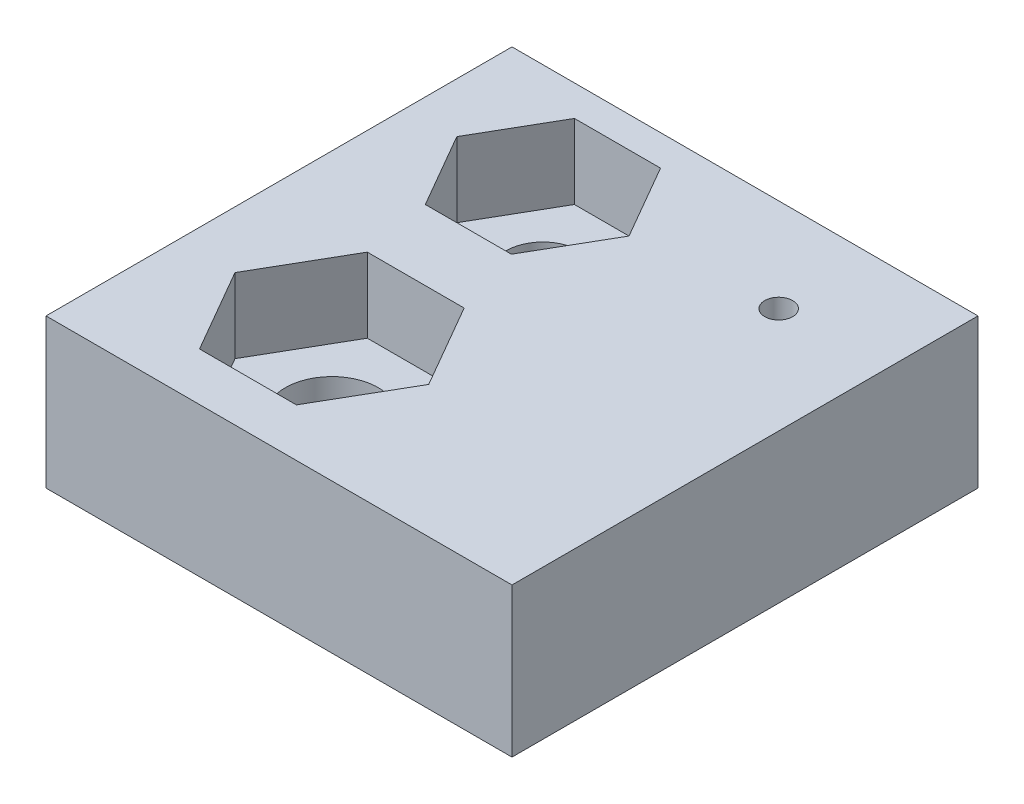
ISO-10303-21;
HEADER;
FILE_DESCRIPTION(('STEP AP214'),'2;1');
FILE_NAME('part.step','',(''),(''),'','','');
FILE_SCHEMA(('AUTOMOTIVE_DESIGN { 1 0 10303 214 1 1 1 1 }'));
ENDSEC;
DATA;
#1=APPLICATION_CONTEXT('core data for automotive mechanical design processes');
#2=APPLICATION_PROTOCOL_DEFINITION('international standard','automotive_design',2000,#1);
#3=PRODUCT_CONTEXT('',#1,'mechanical');
#4=PRODUCT('Part','Part','',(#3));
#5=PRODUCT_RELATED_PRODUCT_CATEGORY('part','',(#4));
#6=PRODUCT_DEFINITION_FORMATION('','',#4);
#7=PRODUCT_DEFINITION_CONTEXT('part definition',#1,'design');
#8=PRODUCT_DEFINITION('design','',#6,#7);
#9=PRODUCT_DEFINITION_SHAPE('','',#8);
#10=(LENGTH_UNIT() NAMED_UNIT(*) SI_UNIT(.MILLI.,.METRE.));
#11=(NAMED_UNIT(*) PLANE_ANGLE_UNIT() SI_UNIT($,.RADIAN.));
#12=(NAMED_UNIT(*) SI_UNIT($,.STERADIAN.) SOLID_ANGLE_UNIT());
#13=UNCERTAINTY_MEASURE_WITH_UNIT(LENGTH_MEASURE(1.E-05),#10,'distance_accuracy_value','');
#14=(GEOMETRIC_REPRESENTATION_CONTEXT(3) GLOBAL_UNCERTAINTY_ASSIGNED_CONTEXT((#13)) GLOBAL_UNIT_ASSIGNED_CONTEXT((#10,
#11,#12)) REPRESENTATION_CONTEXT('',''));
#15=CARTESIAN_POINT('',(0.,0.,0.));
#16=DIRECTION('',(0.,0.,1.));
#17=DIRECTION('',(1.,0.,0.));
#18=AXIS2_PLACEMENT_3D('',#15,#16,#17);
#19=CARTESIAN_POINT('',(-5.1912484109974,0.,-6.85004534126854));
#20=DIRECTION('',(0.,1.,0.));
#21=DIRECTION('',(0.,0.,1.));
#22=AXIS2_PLACEMENT_3D('',#19,#20,#21);
#23=CYLINDRICAL_SURFACE('',#22,2.);
#24=CARTESIAN_POINT('',(-5.1912484109974,0.,-6.85004534126854));
#25=DIRECTION('',(0.,1.,0.));
#26=DIRECTION('',(0.,0.,1.));
#27=AXIS2_PLACEMENT_3D('',#24,#25,#26);
#28=CIRCLE('',#27,2.);
#29=CARTESIAN_POINT('',(-5.1912484109974,0.,-4.85004534126854));
#30=VERTEX_POINT('',#29);
#31=EDGE_CURVE('E256',#30,#30,#28,.T.);
#32=ORIENTED_EDGE('',*,*,#31,.F.);
#33=EDGE_LOOP('',(#32));
#34=FACE_BOUND('',#33,.T.);
#35=CARTESIAN_POINT('',(-5.1912484109974,4.,-6.85004534126854));
#36=DIRECTION('',(0.,1.,0.));
#37=DIRECTION('',(0.,0.,1.));
#38=AXIS2_PLACEMENT_3D('',#35,#36,#37);
#39=CIRCLE('',#38,2.);
#40=CARTESIAN_POINT('',(-5.1912484109974,4.,-4.85004534126854));
#41=VERTEX_POINT('',#40);
#42=EDGE_CURVE('E40',#41,#41,#39,.F.);
#43=ORIENTED_EDGE('',*,*,#42,.F.);
#44=EDGE_LOOP('',(#43));
#45=FACE_BOUND('',#44,.T.);
#46=ADVANCED_FACE('F36',(#34,#45),#23,.F.);
#47=CARTESIAN_POINT('',(-4.24738506354333,0.,5.41777561438636));
#48=DIRECTION('',(0.,1.,0.));
#49=DIRECTION('',(0.,0.,1.));
#50=AXIS2_PLACEMENT_3D('',#47,#48,#49);
#51=CYLINDRICAL_SURFACE('',#50,2.5);
#52=CARTESIAN_POINT('',(-4.24738506354333,0.,5.41777561438636));
#53=DIRECTION('',(0.,1.,0.));
#54=DIRECTION('',(0.,0.,1.));
#55=AXIS2_PLACEMENT_3D('',#52,#53,#54);
#56=CIRCLE('',#55,2.5);
#57=CARTESIAN_POINT('',(-4.24738506354333,0.,7.91777561438636));
#58=VERTEX_POINT('',#57);
#59=EDGE_CURVE('E260',#58,#58,#56,.T.);
#60=ORIENTED_EDGE('',*,*,#59,.F.);
#61=EDGE_LOOP('',(#60));
#62=FACE_BOUND('',#61,.T.);
#63=CARTESIAN_POINT('',(-4.24738506354333,4.,5.41777561438636));
#64=DIRECTION('',(0.,1.,0.));
#65=DIRECTION('',(0.,0.,1.));
#66=AXIS2_PLACEMENT_3D('',#63,#64,#65);
#67=CIRCLE('',#66,2.5);
#68=CARTESIAN_POINT('',(-4.24738506354333,4.,7.91777561438636));
#69=VERTEX_POINT('',#68);
#70=EDGE_CURVE('E200',#69,#69,#67,.F.);
#71=ORIENTED_EDGE('',*,*,#70,.F.);
#72=EDGE_LOOP('',(#71));
#73=FACE_BOUND('',#72,.T.);
#74=ADVANCED_FACE('F297',(#62,#73),#51,.F.);
#75=CARTESIAN_POINT('',(12.5,8.,12.5));
#76=DIRECTION('',(-1.,0.,0.));
#77=DIRECTION('',(0.,0.,1.));
#78=AXIS2_PLACEMENT_3D('',#75,#76,#77);
#79=PLANE('',#78);
#80=DIRECTION('',(0.,0.,-1.));
#81=VECTOR('',#80,1.);
#82=CARTESIAN_POINT('',(12.5,0.,12.5));
#83=LINE('',#82,#81);
#84=CARTESIAN_POINT('',(12.5,0.,12.5));
#85=VERTEX_POINT('',#84);
#86=CARTESIAN_POINT('',(12.5,0.,-12.5));
#87=VERTEX_POINT('',#86);
#88=EDGE_CURVE('E265',#85,#87,#83,.T.);
#89=ORIENTED_EDGE('',*,*,#88,.T.);
#90=DIRECTION('',(0.,-1.,0.));
#91=VECTOR('',#90,1.);
#92=CARTESIAN_POINT('',(12.5,8.,-12.5));
#93=LINE('',#92,#91);
#94=CARTESIAN_POINT('',(12.5,8.,-12.5));
#95=VERTEX_POINT('',#94);
#96=EDGE_CURVE('E11',#95,#87,#93,.T.);
#97=ORIENTED_EDGE('',*,*,#96,.F.);
#98=DIRECTION('',(0.,0.,-1.));
#99=VECTOR('',#98,1.);
#100=CARTESIAN_POINT('',(12.5,8.,12.5));
#101=LINE('',#100,#99);
#102=CARTESIAN_POINT('',(12.5,8.,12.5));
#103=VERTEX_POINT('',#102);
#104=EDGE_CURVE('E266',#103,#95,#101,.T.);
#105=ORIENTED_EDGE('',*,*,#104,.F.);
#106=DIRECTION('',(0.,-1.,0.));
#107=VECTOR('',#106,1.);
#108=CARTESIAN_POINT('',(12.5,8.,12.5));
#109=LINE('',#108,#107);
#110=EDGE_CURVE('E276',#103,#85,#109,.T.);
#111=ORIENTED_EDGE('',*,*,#110,.T.);
#112=EDGE_LOOP('',(#89,#97,#105,#111));
#113=FACE_BOUND('',#112,.T.);
#114=ADVANCED_FACE('F38',(#113),#79,.F.);
#115=CARTESIAN_POINT('',(-12.5,8.,-12.5));
#116=DIRECTION('',(0.,0.,1.));
#117=DIRECTION('',(1.,0.,0.));
#118=AXIS2_PLACEMENT_3D('',#115,#116,#117);
#119=PLANE('',#118);
#120=DIRECTION('',(-1.,0.,0.));
#121=VECTOR('',#120,1.);
#122=CARTESIAN_POINT('',(-12.5,0.,-12.5));
#123=LINE('',#122,#121);
#124=CARTESIAN_POINT('',(-12.5,0.,-12.5));
#125=VERTEX_POINT('',#124);
#126=EDGE_CURVE('E279',#87,#125,#123,.T.);
#127=ORIENTED_EDGE('',*,*,#126,.T.);
#128=DIRECTION('',(0.,-1.,0.));
#129=VECTOR('',#128,1.);
#130=CARTESIAN_POINT('',(-12.5,8.,-12.5));
#131=LINE('',#130,#129);
#132=CARTESIAN_POINT('',(-12.5,8.,-12.5));
#133=VERTEX_POINT('',#132);
#134=EDGE_CURVE('E45',#133,#125,#131,.T.);
#135=ORIENTED_EDGE('',*,*,#134,.F.);
#136=DIRECTION('',(-1.,0.,0.));
#137=VECTOR('',#136,1.);
#138=CARTESIAN_POINT('',(-12.5,8.,-12.5));
#139=LINE('',#138,#137);
#140=EDGE_CURVE('E269',#95,#133,#139,.T.);
#141=ORIENTED_EDGE('',*,*,#140,.F.);
#142=ORIENTED_EDGE('',*,*,#96,.T.);
#143=EDGE_LOOP('',(#127,#135,#141,#142));
#144=FACE_BOUND('',#143,.T.);
#145=ADVANCED_FACE('F323',(#144),#119,.F.);
#146=CARTESIAN_POINT('',(-12.5,8.,12.5));
#147=DIRECTION('',(1.,0.,0.));
#148=DIRECTION('',(0.,0.,-1.));
#149=AXIS2_PLACEMENT_3D('',#146,#147,#148);
#150=PLANE('',#149);
#151=DIRECTION('',(0.,0.,1.));
#152=VECTOR('',#151,1.);
#153=CARTESIAN_POINT('',(-12.5,0.,12.5));
#154=LINE('',#153,#152);
#155=CARTESIAN_POINT('',(-12.5,0.,12.5));
#156=VERTEX_POINT('',#155);
#157=EDGE_CURVE('E281',#125,#156,#154,.T.);
#158=ORIENTED_EDGE('',*,*,#157,.T.);
#159=DIRECTION('',(0.,-1.,0.));
#160=VECTOR('',#159,1.);
#161=CARTESIAN_POINT('',(-12.5,8.,12.5));
#162=LINE('',#161,#160);
#163=CARTESIAN_POINT('',(-12.5,8.,12.5));
#164=VERTEX_POINT('',#163);
#165=EDGE_CURVE('E286',#164,#156,#162,.T.);
#166=ORIENTED_EDGE('',*,*,#165,.F.);
#167=DIRECTION('',(0.,0.,1.));
#168=VECTOR('',#167,1.);
#169=CARTESIAN_POINT('',(-12.5,8.,12.5));
#170=LINE('',#169,#168);
#171=EDGE_CURVE('E272',#133,#164,#170,.T.);
#172=ORIENTED_EDGE('',*,*,#171,.F.);
#173=ORIENTED_EDGE('',*,*,#134,.T.);
#174=EDGE_LOOP('',(#158,#166,#172,#173));
#175=FACE_BOUND('',#174,.T.);
#176=ADVANCED_FACE('F320',(#175),#150,.F.);
#177=CARTESIAN_POINT('',(-12.5,8.,12.5));
#178=DIRECTION('',(0.,0.,-1.));
#179=DIRECTION('',(-1.,0.,0.));
#180=AXIS2_PLACEMENT_3D('',#177,#178,#179);
#181=PLANE('',#180);
#182=DIRECTION('',(1.,0.,0.));
#183=VECTOR('',#182,1.);
#184=CARTESIAN_POINT('',(-12.5,0.,12.5));
#185=LINE('',#184,#183);
#186=EDGE_CURVE('E270',#156,#85,#185,.T.);
#187=ORIENTED_EDGE('',*,*,#186,.T.);
#188=ORIENTED_EDGE('',*,*,#110,.F.);
#189=DIRECTION('',(1.,0.,0.));
#190=VECTOR('',#189,1.);
#191=CARTESIAN_POINT('',(-12.5,8.,12.5));
#192=LINE('',#191,#190);
#193=EDGE_CURVE('E274',#164,#103,#192,.T.);
#194=ORIENTED_EDGE('',*,*,#193,.F.);
#195=ORIENTED_EDGE('',*,*,#165,.T.);
#196=EDGE_LOOP('',(#187,#188,#194,#195));
#197=FACE_BOUND('',#196,.T.);
#198=ADVANCED_FACE('F312',(#197),#181,.F.);
#199=CARTESIAN_POINT('',(0.,8.,0.));
#200=DIRECTION('',(0.,-1.,0.));
#201=DIRECTION('',(0.,0.,-1.));
#202=AXIS2_PLACEMENT_3D('',#199,#200,#201);
#203=PLANE('',#202);
#204=DIRECTION('',(-0.5,0.,-0.866025403784439));
#205=VECTOR('',#204,1.);
#206=CARTESIAN_POINT('',(-0.572446257480399,8.,-6.85004534126854));
#207=LINE('',#206,#205);
#208=CARTESIAN_POINT('',(-0.572446257480399,8.,-6.85004534126854));
#209=VERTEX_POINT('',#208);
#210=CARTESIAN_POINT('',(-2.8818473342389,8.,-10.8500453412685));
#211=VERTEX_POINT('',#210);
#212=EDGE_CURVE('E187',#209,#211,#207,.T.);
#213=ORIENTED_EDGE('',*,*,#212,.F.);
#214=DIRECTION('',(0.5,0.,-0.866025403784438));
#215=VECTOR('',#214,1.);
#216=CARTESIAN_POINT('',(-2.8818473342389,8.,-2.85004534126854));
#217=LINE('',#216,#215);
#218=CARTESIAN_POINT('',(-2.8818473342389,8.,-2.85004534126854));
#219=VERTEX_POINT('',#218);
#220=EDGE_CURVE('E53',#219,#209,#217,.T.);
#221=ORIENTED_EDGE('',*,*,#220,.F.);
#222=DIRECTION('',(1.,0.,0.));
#223=VECTOR('',#222,1.);
#224=CARTESIAN_POINT('',(-7.50064948775591,8.,-2.85004534126854));
#225=LINE('',#224,#223);
#226=CARTESIAN_POINT('',(-7.50064948775591,8.,-2.85004534126854));
#227=VERTEX_POINT('',#226);
#228=EDGE_CURVE('E173',#227,#219,#225,.T.);
#229=ORIENTED_EDGE('',*,*,#228,.F.);
#230=DIRECTION('',(0.5,0.,0.866025403784439));
#231=VECTOR('',#230,1.);
#232=CARTESIAN_POINT('',(-9.81005056451441,8.,-6.85004534126854));
#233=LINE('',#232,#231);
#234=CARTESIAN_POINT('',(-9.81005056451441,8.,-6.85004534126854));
#235=VERTEX_POINT('',#234);
#236=EDGE_CURVE('E176',#235,#227,#233,.T.);
#237=ORIENTED_EDGE('',*,*,#236,.F.);
#238=DIRECTION('',(-0.5,0.,0.866025403784439));
#239=VECTOR('',#238,1.);
#240=CARTESIAN_POINT('',(-7.50064948775591,8.,-10.8500453412685));
#241=LINE('',#240,#239);
#242=CARTESIAN_POINT('',(-7.50064948775591,8.,-10.8500453412685));
#243=VERTEX_POINT('',#242);
#244=EDGE_CURVE('E193',#243,#235,#241,.T.);
#245=ORIENTED_EDGE('',*,*,#244,.F.);
#246=DIRECTION('',(-1.,0.,0.));
#247=VECTOR('',#246,1.);
#248=CARTESIAN_POINT('',(-2.8818473342389,8.,-10.8500453412685));
#249=LINE('',#248,#247);
#250=EDGE_CURVE('E190',#211,#243,#249,.T.);
#251=ORIENTED_EDGE('',*,*,#250,.F.);
#252=EDGE_LOOP('',(#213,#221,#229,#237,#245,#251));
#253=FACE_BOUND('',#252,.T.);
#254=DIRECTION('',(-0.5,0.,-0.866025403784439));
#255=VECTOR('',#254,1.);
#256=CARTESIAN_POINT('',(0.948767359163301,8.,5.41777561438636));
#257=LINE('',#256,#255);
#258=CARTESIAN_POINT('',(0.948767359163301,8.,5.41777561438636));
#259=VERTEX_POINT('',#258);
#260=CARTESIAN_POINT('',(-1.64930885219001,8.,0.917775614386364));
#261=VERTEX_POINT('',#260);
#262=EDGE_CURVE('E229',#259,#261,#257,.T.);
#263=ORIENTED_EDGE('',*,*,#262,.F.);
#264=DIRECTION('',(0.5,0.,-0.866025403784439));
#265=VECTOR('',#264,1.);
#266=CARTESIAN_POINT('',(-1.64930885219001,8.,9.91777561438636));
#267=LINE('',#266,#265);
#268=CARTESIAN_POINT('',(-1.64930885219001,8.,9.91777561438636));
#269=VERTEX_POINT('',#268);
#270=EDGE_CURVE('E61',#269,#259,#267,.T.);
#271=ORIENTED_EDGE('',*,*,#270,.F.);
#272=DIRECTION('',(1.,0.,0.));
#273=VECTOR('',#272,1.);
#274=CARTESIAN_POINT('',(-6.84546127489665,8.,9.91777561438636));
#275=LINE('',#274,#273);
#276=CARTESIAN_POINT('',(-6.84546127489665,8.,9.91777561438636));
#277=VERTEX_POINT('',#276);
#278=EDGE_CURVE('E212',#277,#269,#275,.T.);
#279=ORIENTED_EDGE('',*,*,#278,.F.);
#280=DIRECTION('',(0.5,0.,0.866025403784439));
#281=VECTOR('',#280,1.);
#282=CARTESIAN_POINT('',(-9.44353748624996,8.,5.41777561438636));
#283=LINE('',#282,#281);
#284=CARTESIAN_POINT('',(-9.44353748624996,8.,5.41777561438636));
#285=VERTEX_POINT('',#284);
#286=EDGE_CURVE('E238',#285,#277,#283,.T.);
#287=ORIENTED_EDGE('',*,*,#286,.F.);
#288=DIRECTION('',(-0.5,0.,0.866025403784439));
#289=VECTOR('',#288,1.);
#290=CARTESIAN_POINT('',(-6.84546127489664,8.,0.917775614386363));
#291=LINE('',#290,#289);
#292=CARTESIAN_POINT('',(-6.84546127489664,8.,0.917775614386363));
#293=VERTEX_POINT('',#292);
#294=EDGE_CURVE('E235',#293,#285,#291,.T.);
#295=ORIENTED_EDGE('',*,*,#294,.F.);
#296=DIRECTION('',(-1.,0.,0.));
#297=VECTOR('',#296,1.);
#298=CARTESIAN_POINT('',(-1.64930885219001,8.,0.917775614386364));
#299=LINE('',#298,#297);
#300=EDGE_CURVE('E232',#261,#293,#299,.T.);
#301=ORIENTED_EDGE('',*,*,#300,.F.);
#302=EDGE_LOOP('',(#263,#271,#279,#287,#295,#301));
#303=FACE_BOUND('',#302,.T.);
#304=CARTESIAN_POINT('',(6.81469336861842,8.,-7.49187241753731));
#305=DIRECTION('',(0.,1.,0.));
#306=DIRECTION('',(0.,0.,1.));
#307=AXIS2_PLACEMENT_3D('',#304,#305,#306);
#308=CIRCLE('',#307,0.75);
#309=CARTESIAN_POINT('',(6.81469336861842,8.,-6.74187241753731));
#310=VERTEX_POINT('',#309);
#311=EDGE_CURVE('E257',#310,#310,#308,.T.);
#312=ORIENTED_EDGE('',*,*,#311,.F.);
#313=EDGE_LOOP('',(#312));
#314=FACE_BOUND('',#313,.T.);
#315=ORIENTED_EDGE('',*,*,#104,.T.);
#316=ORIENTED_EDGE('',*,*,#140,.T.);
#317=ORIENTED_EDGE('',*,*,#171,.T.);
#318=ORIENTED_EDGE('',*,*,#193,.T.);
#319=EDGE_LOOP('',(#315,#316,#317,#318));
#320=FACE_BOUND('',#319,.T.);
#321=ADVANCED_FACE('F308',(#253,#303,#314,#320),#203,.F.);
#322=CARTESIAN_POINT('',(0.,0.,0.));
#323=DIRECTION('',(0.,-1.,0.));
#324=DIRECTION('',(0.,0.,-1.));
#325=AXIS2_PLACEMENT_3D('',#322,#323,#324);
#326=PLANE('',#325);
#327=ORIENTED_EDGE('',*,*,#59,.T.);
#328=EDGE_LOOP('',(#327));
#329=FACE_BOUND('',#328,.T.);
#330=CARTESIAN_POINT('',(6.81469336861842,0.,-7.49187241753731));
#331=DIRECTION('',(0.,1.,0.));
#332=DIRECTION('',(0.,0.,1.));
#333=AXIS2_PLACEMENT_3D('',#330,#331,#332);
#334=CIRCLE('',#333,0.75);
#335=CARTESIAN_POINT('',(6.81469336861842,0.,-6.74187241753731));
#336=VERTEX_POINT('',#335);
#337=EDGE_CURVE('E253',#336,#336,#334,.T.);
#338=ORIENTED_EDGE('',*,*,#337,.T.);
#339=EDGE_LOOP('',(#338));
#340=FACE_BOUND('',#339,.T.);
#341=ORIENTED_EDGE('',*,*,#31,.T.);
#342=EDGE_LOOP('',(#341));
#343=FACE_BOUND('',#342,.T.);
#344=ORIENTED_EDGE('',*,*,#88,.F.);
#345=ORIENTED_EDGE('',*,*,#186,.F.);
#346=ORIENTED_EDGE('',*,*,#157,.F.);
#347=ORIENTED_EDGE('',*,*,#126,.F.);
#348=EDGE_LOOP('',(#344,#345,#346,#347));
#349=FACE_BOUND('',#348,.T.);
#350=ADVANCED_FACE('F311',(#329,#340,#343,#349),#326,.T.);
#351=CARTESIAN_POINT('',(6.81469336861842,0.,-7.49187241753731));
#352=DIRECTION('',(0.,1.,0.));
#353=DIRECTION('',(0.,0.,1.));
#354=AXIS2_PLACEMENT_3D('',#351,#352,#353);
#355=CYLINDRICAL_SURFACE('',#354,0.75);
#356=ORIENTED_EDGE('',*,*,#337,.F.);
#357=EDGE_LOOP('',(#356));
#358=FACE_BOUND('',#357,.T.);
#359=ORIENTED_EDGE('',*,*,#311,.T.);
#360=EDGE_LOOP('',(#359));
#361=FACE_BOUND('',#360,.T.);
#362=ADVANCED_FACE('F316',(#358,#361),#355,.F.);
#363=CARTESIAN_POINT('',(0.,4.,0.));
#364=DIRECTION('',(0.,1.,0.));
#365=DIRECTION('',(0.,0.,1.));
#366=AXIS2_PLACEMENT_3D('',#363,#364,#365);
#367=PLANE('',#366);
#368=DIRECTION('',(0.5,0.,-0.866025403784439));
#369=VECTOR('',#368,1.);
#370=CARTESIAN_POINT('',(-1.64930885219001,4.,9.91777561438636));
#371=LINE('',#370,#369);
#372=CARTESIAN_POINT('',(-1.64930885219001,4.,9.91777561438636));
#373=VERTEX_POINT('',#372);
#374=CARTESIAN_POINT('',(0.948767359163301,4.,5.41777561438636));
#375=VERTEX_POINT('',#374);
#376=EDGE_CURVE('E208',#373,#375,#371,.T.);
#377=ORIENTED_EDGE('',*,*,#376,.T.);
#378=DIRECTION('',(-0.5,0.,-0.866025403784439));
#379=VECTOR('',#378,1.);
#380=CARTESIAN_POINT('',(0.948767359163301,4.,5.41777561438636));
#381=LINE('',#380,#379);
#382=CARTESIAN_POINT('',(-1.64930885219001,4.,0.917775614386364));
#383=VERTEX_POINT('',#382);
#384=EDGE_CURVE('E211',#375,#383,#381,.T.);
#385=ORIENTED_EDGE('',*,*,#384,.T.);
#386=DIRECTION('',(-1.,0.,0.));
#387=VECTOR('',#386,1.);
#388=CARTESIAN_POINT('',(-1.64930885219001,4.,0.917775614386364));
#389=LINE('',#388,#387);
#390=CARTESIAN_POINT('',(-6.84546127489664,4.,0.917775614386363));
#391=VERTEX_POINT('',#390);
#392=EDGE_CURVE('E215',#383,#391,#389,.T.);
#393=ORIENTED_EDGE('',*,*,#392,.T.);
#394=DIRECTION('',(-0.5,0.,0.866025403784439));
#395=VECTOR('',#394,1.);
#396=CARTESIAN_POINT('',(-6.84546127489664,4.,0.917775614386363));
#397=LINE('',#396,#395);
#398=CARTESIAN_POINT('',(-9.44353748624996,4.,5.41777561438636));
#399=VERTEX_POINT('',#398);
#400=EDGE_CURVE('E218',#391,#399,#397,.T.);
#401=ORIENTED_EDGE('',*,*,#400,.T.);
#402=DIRECTION('',(0.5,0.,0.866025403784439));
#403=VECTOR('',#402,1.);
#404=CARTESIAN_POINT('',(-9.44353748624996,4.,5.41777561438636));
#405=LINE('',#404,#403);
#406=CARTESIAN_POINT('',(-6.84546127489665,4.,9.91777561438636));
#407=VERTEX_POINT('',#406);
#408=EDGE_CURVE('E221',#399,#407,#405,.T.);
#409=ORIENTED_EDGE('',*,*,#408,.T.);
#410=DIRECTION('',(1.,0.,0.));
#411=VECTOR('',#410,1.);
#412=CARTESIAN_POINT('',(-6.84546127489665,4.,9.91777561438636));
#413=LINE('',#412,#411);
#414=EDGE_CURVE('E224',#407,#373,#413,.T.);
#415=ORIENTED_EDGE('',*,*,#414,.T.);
#416=EDGE_LOOP('',(#377,#385,#393,#401,#409,#415));
#417=FACE_BOUND('',#416,.T.);
#418=ORIENTED_EDGE('',*,*,#70,.T.);
#419=EDGE_LOOP('',(#418));
#420=FACE_BOUND('',#419,.T.);
#421=ADVANCED_FACE('F366',(#417,#420),#367,.T.);
#422=CARTESIAN_POINT('',(-1.64930885219001,4.,9.91777561438636));
#423=DIRECTION('',(0.866025403784439,0.,0.5));
#424=DIRECTION('',(0.5,0.,-0.866025403784439));
#425=AXIS2_PLACEMENT_3D('',#422,#423,#424);
#426=PLANE('',#425);
#427=ORIENTED_EDGE('',*,*,#270,.T.);
#428=DIRECTION('',(0.,1.,0.));
#429=VECTOR('',#428,1.);
#430=CARTESIAN_POINT('',(0.948767359163301,4.,5.41777561438636));
#431=LINE('',#430,#429);
#432=EDGE_CURVE('E227',#375,#259,#431,.T.);
#433=ORIENTED_EDGE('',*,*,#432,.F.);
#434=ORIENTED_EDGE('',*,*,#376,.F.);
#435=DIRECTION('',(0.,1.,0.));
#436=VECTOR('',#435,1.);
#437=CARTESIAN_POINT('',(-1.64930885219001,4.,9.91777561438636));
#438=LINE('',#437,#436);
#439=EDGE_CURVE('E188',#373,#269,#438,.T.);
#440=ORIENTED_EDGE('',*,*,#439,.T.);
#441=EDGE_LOOP('',(#427,#433,#434,#440));
#442=FACE_BOUND('',#441,.T.);
#443=ADVANCED_FACE('F371',(#442),#426,.F.);
#444=CARTESIAN_POINT('',(-6.84546127489665,4.,9.91777561438636));
#445=DIRECTION('',(0.,0.,1.));
#446=DIRECTION('',(1.,0.,0.));
#447=AXIS2_PLACEMENT_3D('',#444,#445,#446);
#448=PLANE('',#447);
#449=ORIENTED_EDGE('',*,*,#278,.T.);
#450=ORIENTED_EDGE('',*,*,#439,.F.);
#451=ORIENTED_EDGE('',*,*,#414,.F.);
#452=DIRECTION('',(0.,1.,0.));
#453=VECTOR('',#452,1.);
#454=CARTESIAN_POINT('',(-6.84546127489665,4.,9.91777561438636));
#455=LINE('',#454,#453);
#456=EDGE_CURVE('E244',#407,#277,#455,.T.);
#457=ORIENTED_EDGE('',*,*,#456,.T.);
#458=EDGE_LOOP('',(#449,#450,#451,#457));
#459=FACE_BOUND('',#458,.T.);
#460=ADVANCED_FACE('F382',(#459),#448,.F.);
#461=CARTESIAN_POINT('',(-9.44353748624996,4.,5.41777561438636));
#462=DIRECTION('',(-0.866025403784439,0.,0.5));
#463=DIRECTION('',(0.5,0.,0.866025403784439));
#464=AXIS2_PLACEMENT_3D('',#461,#462,#463);
#465=PLANE('',#464);
#466=ORIENTED_EDGE('',*,*,#286,.T.);
#467=ORIENTED_EDGE('',*,*,#456,.F.);
#468=ORIENTED_EDGE('',*,*,#408,.F.);
#469=DIRECTION('',(0.,1.,0.));
#470=VECTOR('',#469,1.);
#471=CARTESIAN_POINT('',(-9.44353748624996,4.,5.41777561438636));
#472=LINE('',#471,#470);
#473=EDGE_CURVE('E246',#399,#285,#472,.T.);
#474=ORIENTED_EDGE('',*,*,#473,.T.);
#475=EDGE_LOOP('',(#466,#467,#468,#474));
#476=FACE_BOUND('',#475,.T.);
#477=ADVANCED_FACE('F391',(#476),#465,.F.);
#478=CARTESIAN_POINT('',(-6.84546127489664,4.,0.917775614386363));
#479=DIRECTION('',(-0.866025403784439,0.,-0.5));
#480=DIRECTION('',(-0.5,0.,0.866025403784439));
#481=AXIS2_PLACEMENT_3D('',#478,#479,#480);
#482=PLANE('',#481);
#483=ORIENTED_EDGE('',*,*,#294,.T.);
#484=ORIENTED_EDGE('',*,*,#473,.F.);
#485=ORIENTED_EDGE('',*,*,#400,.F.);
#486=DIRECTION('',(0.,1.,0.));
#487=VECTOR('',#486,1.);
#488=CARTESIAN_POINT('',(-6.84546127489664,4.,0.917775614386363));
#489=LINE('',#488,#487);
#490=EDGE_CURVE('E248',#391,#293,#489,.T.);
#491=ORIENTED_EDGE('',*,*,#490,.T.);
#492=EDGE_LOOP('',(#483,#484,#485,#491));
#493=FACE_BOUND('',#492,.T.);
#494=ADVANCED_FACE('F401',(#493),#482,.F.);
#495=CARTESIAN_POINT('',(-1.64930885219001,4.,0.917775614386364));
#496=DIRECTION('',(0.,0.,-1.));
#497=DIRECTION('',(-1.,0.,0.));
#498=AXIS2_PLACEMENT_3D('',#495,#496,#497);
#499=PLANE('',#498);
#500=ORIENTED_EDGE('',*,*,#300,.T.);
#501=ORIENTED_EDGE('',*,*,#490,.F.);
#502=ORIENTED_EDGE('',*,*,#392,.F.);
#503=DIRECTION('',(0.,1.,0.));
#504=VECTOR('',#503,1.);
#505=CARTESIAN_POINT('',(-1.64930885219001,4.,0.917775614386364));
#506=LINE('',#505,#504);
#507=EDGE_CURVE('E250',#383,#261,#506,.T.);
#508=ORIENTED_EDGE('',*,*,#507,.T.);
#509=EDGE_LOOP('',(#500,#501,#502,#508));
#510=FACE_BOUND('',#509,.T.);
#511=ADVANCED_FACE('F411',(#510),#499,.F.);
#512=CARTESIAN_POINT('',(0.948767359163301,4.,5.41777561438636));
#513=DIRECTION('',(0.866025403784439,0.,-0.5));
#514=DIRECTION('',(-0.5,0.,-0.866025403784439));
#515=AXIS2_PLACEMENT_3D('',#512,#513,#514);
#516=PLANE('',#515);
#517=ORIENTED_EDGE('',*,*,#262,.T.);
#518=ORIENTED_EDGE('',*,*,#507,.F.);
#519=ORIENTED_EDGE('',*,*,#384,.F.);
#520=ORIENTED_EDGE('',*,*,#432,.T.);
#521=EDGE_LOOP('',(#517,#518,#519,#520));
#522=FACE_BOUND('',#521,.T.);
#523=ADVANCED_FACE('F421',(#522),#516,.F.);
#524=CARTESIAN_POINT('',(0.,4.,0.));
#525=DIRECTION('',(0.,1.,0.));
#526=DIRECTION('',(0.,0.,1.));
#527=AXIS2_PLACEMENT_3D('',#524,#525,#526);
#528=PLANE('',#527);
#529=DIRECTION('',(0.5,0.,-0.866025403784438));
#530=VECTOR('',#529,1.);
#531=CARTESIAN_POINT('',(-2.8818473342389,4.,-2.85004534126854));
#532=LINE('',#531,#530);
#533=CARTESIAN_POINT('',(-2.8818473342389,4.,-2.85004534126854));
#534=VERTEX_POINT('',#533);
#535=CARTESIAN_POINT('',(-0.572446257480399,4.,-6.85004534126854));
#536=VERTEX_POINT('',#535);
#537=EDGE_CURVE('E153',#534,#536,#532,.T.);
#538=ORIENTED_EDGE('',*,*,#537,.T.);
#539=DIRECTION('',(-0.5,0.,-0.866025403784439));
#540=VECTOR('',#539,1.);
#541=CARTESIAN_POINT('',(-0.572446257480399,4.,-6.85004534126854));
#542=LINE('',#541,#540);
#543=CARTESIAN_POINT('',(-2.8818473342389,4.,-10.8500453412685));
#544=VERTEX_POINT('',#543);
#545=EDGE_CURVE('E162',#536,#544,#542,.T.);
#546=ORIENTED_EDGE('',*,*,#545,.T.);
#547=DIRECTION('',(-1.,0.,0.));
#548=VECTOR('',#547,1.);
#549=CARTESIAN_POINT('',(-2.8818473342389,4.,-10.8500453412685));
#550=LINE('',#549,#548);
#551=CARTESIAN_POINT('',(-7.50064948775591,4.,-10.8500453412685));
#552=VERTEX_POINT('',#551);
#553=EDGE_CURVE('E167',#544,#552,#550,.T.);
#554=ORIENTED_EDGE('',*,*,#553,.T.);
#555=DIRECTION('',(-0.5,0.,0.866025403784439));
#556=VECTOR('',#555,1.);
#557=CARTESIAN_POINT('',(-7.50064948775591,4.,-10.8500453412685));
#558=LINE('',#557,#556);
#559=CARTESIAN_POINT('',(-9.81005056451441,4.,-6.85004534126854));
#560=VERTEX_POINT('',#559);
#561=EDGE_CURVE('E180',#552,#560,#558,.T.);
#562=ORIENTED_EDGE('',*,*,#561,.T.);
#563=DIRECTION('',(0.5,0.,0.866025403784439));
#564=VECTOR('',#563,1.);
#565=CARTESIAN_POINT('',(-9.81005056451441,4.,-6.85004534126854));
#566=LINE('',#565,#564);
#567=CARTESIAN_POINT('',(-7.50064948775591,4.,-2.85004534126854));
#568=VERTEX_POINT('',#567);
#569=EDGE_CURVE('E183',#560,#568,#566,.T.);
#570=ORIENTED_EDGE('',*,*,#569,.T.);
#571=DIRECTION('',(1.,0.,0.));
#572=VECTOR('',#571,1.);
#573=CARTESIAN_POINT('',(-7.50064948775591,4.,-2.85004534126854));
#574=LINE('',#573,#572);
#575=EDGE_CURVE('E159',#568,#534,#574,.T.);
#576=ORIENTED_EDGE('',*,*,#575,.T.);
#577=EDGE_LOOP('',(#538,#546,#554,#562,#570,#576));
#578=FACE_BOUND('',#577,.T.);
#579=ORIENTED_EDGE('',*,*,#42,.T.);
#580=EDGE_LOOP('',(#579));
#581=FACE_BOUND('',#580,.T.);
#582=ADVANCED_FACE('F169',(#578,#581),#528,.T.);
#583=CARTESIAN_POINT('',(-2.8818473342389,4.,-2.85004534126854));
#584=DIRECTION('',(0.866025403784439,0.,0.5));
#585=DIRECTION('',(0.5,0.,-0.866025403784438));
#586=AXIS2_PLACEMENT_3D('',#583,#584,#585);
#587=PLANE('',#586);
#588=ORIENTED_EDGE('',*,*,#220,.T.);
#589=DIRECTION('',(0.,1.,0.));
#590=VECTOR('',#589,1.);
#591=CARTESIAN_POINT('',(-0.572446257480399,4.,-6.85004534126854));
#592=LINE('',#591,#590);
#593=EDGE_CURVE('E149',#536,#209,#592,.T.);
#594=ORIENTED_EDGE('',*,*,#593,.F.);
#595=ORIENTED_EDGE('',*,*,#537,.F.);
#596=DIRECTION('',(0.,1.,0.));
#597=VECTOR('',#596,1.);
#598=CARTESIAN_POINT('',(-2.8818473342389,4.,-2.85004534126854));
#599=LINE('',#598,#597);
#600=EDGE_CURVE('E198',#534,#219,#599,.T.);
#601=ORIENTED_EDGE('',*,*,#600,.T.);
#602=EDGE_LOOP('',(#588,#594,#595,#601));
#603=FACE_BOUND('',#602,.T.);
#604=ADVANCED_FACE('F151',(#603),#587,.F.);
#605=CARTESIAN_POINT('',(-7.50064948775591,4.,-2.85004534126854));
#606=DIRECTION('',(0.,0.,1.));
#607=DIRECTION('',(1.,0.,0.));
#608=AXIS2_PLACEMENT_3D('',#605,#606,#607);
#609=PLANE('',#608);
#610=ORIENTED_EDGE('',*,*,#228,.T.);
#611=ORIENTED_EDGE('',*,*,#600,.F.);
#612=ORIENTED_EDGE('',*,*,#575,.F.);
#613=DIRECTION('',(0.,1.,0.));
#614=VECTOR('',#613,1.);
#615=CARTESIAN_POINT('',(-7.50064948775591,4.,-2.85004534126854));
#616=LINE('',#615,#614);
#617=EDGE_CURVE('E201',#568,#227,#616,.T.);
#618=ORIENTED_EDGE('',*,*,#617,.T.);
#619=EDGE_LOOP('',(#610,#611,#612,#618));
#620=FACE_BOUND('',#619,.T.);
#621=ADVANCED_FACE('F448',(#620),#609,.F.);
#622=CARTESIAN_POINT('',(-9.81005056451441,4.,-6.85004534126854));
#623=DIRECTION('',(-0.866025403784439,0.,0.5));
#624=DIRECTION('',(0.5,0.,0.866025403784439));
#625=AXIS2_PLACEMENT_3D('',#622,#623,#624);
#626=PLANE('',#625);
#627=ORIENTED_EDGE('',*,*,#236,.T.);
#628=ORIENTED_EDGE('',*,*,#617,.F.);
#629=ORIENTED_EDGE('',*,*,#569,.F.);
#630=DIRECTION('',(0.,1.,0.));
#631=VECTOR('',#630,1.);
#632=CARTESIAN_POINT('',(-9.81005056451441,4.,-6.85004534126854));
#633=LINE('',#632,#631);
#634=EDGE_CURVE('E203',#560,#235,#633,.T.);
#635=ORIENTED_EDGE('',*,*,#634,.T.);
#636=EDGE_LOOP('',(#627,#628,#629,#635));
#637=FACE_BOUND('',#636,.T.);
#638=ADVANCED_FACE('F457',(#637),#626,.F.);
#639=CARTESIAN_POINT('',(-7.50064948775591,4.,-10.8500453412685));
#640=DIRECTION('',(-0.866025403784439,0.,-0.5));
#641=DIRECTION('',(-0.5,0.,0.866025403784439));
#642=AXIS2_PLACEMENT_3D('',#639,#640,#641);
#643=PLANE('',#642);
#644=ORIENTED_EDGE('',*,*,#244,.T.);
#645=ORIENTED_EDGE('',*,*,#634,.F.);
#646=ORIENTED_EDGE('',*,*,#561,.F.);
#647=DIRECTION('',(0.,1.,0.));
#648=VECTOR('',#647,1.);
#649=CARTESIAN_POINT('',(-7.50064948775591,4.,-10.8500453412685));
#650=LINE('',#649,#648);
#651=EDGE_CURVE('E205',#552,#243,#650,.T.);
#652=ORIENTED_EDGE('',*,*,#651,.T.);
#653=EDGE_LOOP('',(#644,#645,#646,#652));
#654=FACE_BOUND('',#653,.T.);
#655=ADVANCED_FACE('F467',(#654),#643,.F.);
#656=CARTESIAN_POINT('',(-2.8818473342389,4.,-10.8500453412685));
#657=DIRECTION('',(0.,0.,-1.));
#658=DIRECTION('',(-1.,0.,0.));
#659=AXIS2_PLACEMENT_3D('',#656,#657,#658);
#660=PLANE('',#659);
#661=ORIENTED_EDGE('',*,*,#250,.T.);
#662=ORIENTED_EDGE('',*,*,#651,.F.);
#663=ORIENTED_EDGE('',*,*,#553,.F.);
#664=DIRECTION('',(0.,1.,0.));
#665=VECTOR('',#664,1.);
#666=CARTESIAN_POINT('',(-2.8818473342389,4.,-10.8500453412685));
#667=LINE('',#666,#665);
#668=EDGE_CURVE('E158',#544,#211,#667,.T.);
#669=ORIENTED_EDGE('',*,*,#668,.T.);
#670=EDGE_LOOP('',(#661,#662,#663,#669));
#671=FACE_BOUND('',#670,.T.);
#672=ADVANCED_FACE('F477',(#671),#660,.F.);
#673=CARTESIAN_POINT('',(-0.572446257480399,4.,-6.85004534126854));
#674=DIRECTION('',(0.866025403784439,0.,-0.5));
#675=DIRECTION('',(-0.5,0.,-0.866025403784439));
#676=AXIS2_PLACEMENT_3D('',#673,#674,#675);
#677=PLANE('',#676);
#678=ORIENTED_EDGE('',*,*,#212,.T.);
#679=ORIENTED_EDGE('',*,*,#668,.F.);
#680=ORIENTED_EDGE('',*,*,#545,.F.);
#681=ORIENTED_EDGE('',*,*,#593,.T.);
#682=EDGE_LOOP('',(#678,#679,#680,#681));
#683=FACE_BOUND('',#682,.T.);
#684=ADVANCED_FACE('F163',(#683),#677,.F.);
#685=CLOSED_SHELL('',(#46,#74,#114,#145,#176,#198,#321,#350,#362,#421,#443,#460,#477,#494,#511,
#523,#582,#604,#621,#638,#655,#672,#684));
#686=MANIFOLD_SOLID_BREP('B2',#685);
#687=ADVANCED_BREP_SHAPE_REPRESENTATION('',(#18,#686),#14);
#688=SHAPE_DEFINITION_REPRESENTATION(#9,#687);
ENDSEC;
END-ISO-10303-21;
